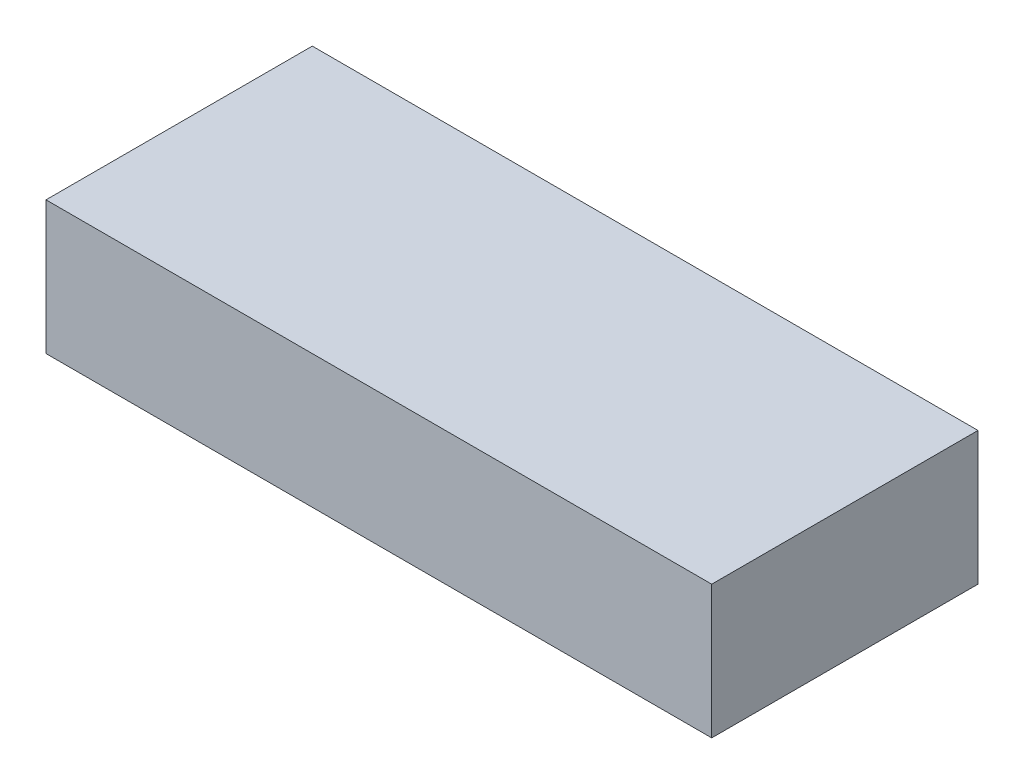
ISO-10303-21;
HEADER;
FILE_DESCRIPTION(('STEP AP214'),'2;1');
FILE_NAME('part.step','',(''),(''),'','','');
FILE_SCHEMA(('AUTOMOTIVE_DESIGN { 1 0 10303 214 1 1 1 1 }'));
ENDSEC;
DATA;
#1=APPLICATION_CONTEXT('core data for automotive mechanical design processes');
#2=APPLICATION_PROTOCOL_DEFINITION('international standard','automotive_design',2000,#1);
#3=PRODUCT_CONTEXT('',#1,'mechanical');
#4=PRODUCT('Part','Part','',(#3));
#5=PRODUCT_RELATED_PRODUCT_CATEGORY('part','',(#4));
#6=PRODUCT_DEFINITION_FORMATION('','',#4);
#7=PRODUCT_DEFINITION_CONTEXT('part definition',#1,'design');
#8=PRODUCT_DEFINITION('design','',#6,#7);
#9=PRODUCT_DEFINITION_SHAPE('','',#8);
#10=(LENGTH_UNIT() NAMED_UNIT(*) SI_UNIT(.MILLI.,.METRE.));
#11=(NAMED_UNIT(*) PLANE_ANGLE_UNIT() SI_UNIT($,.RADIAN.));
#12=(NAMED_UNIT(*) SI_UNIT($,.STERADIAN.) SOLID_ANGLE_UNIT());
#13=UNCERTAINTY_MEASURE_WITH_UNIT(LENGTH_MEASURE(1.E-05),#10,'distance_accuracy_value','');
#14=(GEOMETRIC_REPRESENTATION_CONTEXT(3) GLOBAL_UNCERTAINTY_ASSIGNED_CONTEXT((#13)) GLOBAL_UNIT_ASSIGNED_CONTEXT((#10,
#11,#12)) REPRESENTATION_CONTEXT('',''));
#15=CARTESIAN_POINT('',(0.,0.,0.));
#16=DIRECTION('',(0.,0.,1.));
#17=DIRECTION('',(1.,0.,0.));
#18=AXIS2_PLACEMENT_3D('',#15,#16,#17);
#19=CARTESIAN_POINT('',(500.,200.,-200.));
#20=DIRECTION('',(-1.,0.,0.));
#21=DIRECTION('',(0.,0.,-1.));
#22=AXIS2_PLACEMENT_3D('',#19,#20,#21);
#23=PLANE('',#22);
#24=DIRECTION('',(0.,0.,1.));
#25=VECTOR('',#24,1.);
#26=CARTESIAN_POINT('',(500.,0.,-200.));
#27=LINE('',#26,#25);
#28=CARTESIAN_POINT('',(500.,0.,-200.));
#29=VERTEX_POINT('',#28);
#30=CARTESIAN_POINT('',(500.,0.,200.));
#31=VERTEX_POINT('',#30);
#32=EDGE_CURVE('E116',#29,#31,#27,.T.);
#33=ORIENTED_EDGE('',*,*,#32,.F.);
#34=DIRECTION('',(0.,-1.,0.));
#35=VECTOR('',#34,1.);
#36=CARTESIAN_POINT('',(500.,200.,-200.));
#37=LINE('',#36,#35);
#38=CARTESIAN_POINT('',(500.,200.,-200.));
#39=VERTEX_POINT('',#38);
#40=EDGE_CURVE('E115',#39,#29,#37,.T.);
#41=ORIENTED_EDGE('',*,*,#40,.F.);
#42=DIRECTION('',(0.,0.,1.));
#43=VECTOR('',#42,1.);
#44=CARTESIAN_POINT('',(500.,200.,-200.));
#45=LINE('',#44,#43);
#46=CARTESIAN_POINT('',(500.,200.,200.));
#47=VERTEX_POINT('',#46);
#48=EDGE_CURVE('E108',#39,#47,#45,.T.);
#49=ORIENTED_EDGE('',*,*,#48,.T.);
#50=DIRECTION('',(0.,-1.,0.));
#51=VECTOR('',#50,1.);
#52=CARTESIAN_POINT('',(500.,200.,200.));
#53=LINE('',#52,#51);
#54=EDGE_CURVE('E11',#47,#31,#53,.T.);
#55=ORIENTED_EDGE('',*,*,#54,.T.);
#56=EDGE_LOOP('',(#33,#41,#49,#55));
#57=FACE_BOUND('',#56,.T.);
#58=ADVANCED_FACE('F47',(#57),#23,.F.);
#59=CARTESIAN_POINT('',(-500.,200.,200.));
#60=DIRECTION('',(0.,0.,-1.));
#61=DIRECTION('',(1.,0.,0.));
#62=AXIS2_PLACEMENT_3D('',#59,#60,#61);
#63=PLANE('',#62);
#64=DIRECTION('',(-1.,0.,0.));
#65=VECTOR('',#64,1.);
#66=CARTESIAN_POINT('',(-500.,0.,200.));
#67=LINE('',#66,#65);
#68=CARTESIAN_POINT('',(-500.,0.,200.));
#69=VERTEX_POINT('',#68);
#70=EDGE_CURVE('E119',#31,#69,#67,.T.);
#71=ORIENTED_EDGE('',*,*,#70,.F.);
#72=ORIENTED_EDGE('',*,*,#54,.F.);
#73=DIRECTION('',(-1.,0.,0.));
#74=VECTOR('',#73,1.);
#75=CARTESIAN_POINT('',(-500.,200.,200.));
#76=LINE('',#75,#74);
#77=CARTESIAN_POINT('',(-500.,200.,200.));
#78=VERTEX_POINT('',#77);
#79=EDGE_CURVE('E89',#47,#78,#76,.T.);
#80=ORIENTED_EDGE('',*,*,#79,.T.);
#81=DIRECTION('',(0.,-1.,0.));
#82=VECTOR('',#81,1.);
#83=CARTESIAN_POINT('',(-500.,200.,200.));
#84=LINE('',#83,#82);
#85=EDGE_CURVE('E56',#78,#69,#84,.T.);
#86=ORIENTED_EDGE('',*,*,#85,.T.);
#87=EDGE_LOOP('',(#71,#72,#80,#86));
#88=FACE_BOUND('',#87,.T.);
#89=ADVANCED_FACE('F105',(#88),#63,.F.);
#90=CARTESIAN_POINT('',(-500.,200.,-200.));
#91=DIRECTION('',(1.,0.,0.));
#92=DIRECTION('',(0.,0.,1.));
#93=AXIS2_PLACEMENT_3D('',#90,#91,#92);
#94=PLANE('',#93);
#95=DIRECTION('',(0.,0.,-1.));
#96=VECTOR('',#95,1.);
#97=CARTESIAN_POINT('',(-500.,0.,-200.));
#98=LINE('',#97,#96);
#99=CARTESIAN_POINT('',(-500.,0.,-200.));
#100=VERTEX_POINT('',#99);
#101=EDGE_CURVE('E100',#69,#100,#98,.T.);
#102=ORIENTED_EDGE('',*,*,#101,.F.);
#103=ORIENTED_EDGE('',*,*,#85,.F.);
#104=DIRECTION('',(0.,0.,-1.));
#105=VECTOR('',#104,1.);
#106=CARTESIAN_POINT('',(-500.,200.,-200.));
#107=LINE('',#106,#105);
#108=CARTESIAN_POINT('',(-500.,200.,-200.));
#109=VERTEX_POINT('',#108);
#110=EDGE_CURVE('E92',#78,#109,#107,.T.);
#111=ORIENTED_EDGE('',*,*,#110,.T.);
#112=DIRECTION('',(0.,-1.,0.));
#113=VECTOR('',#112,1.);
#114=CARTESIAN_POINT('',(-500.,200.,-200.));
#115=LINE('',#114,#113);
#116=EDGE_CURVE('E104',#109,#100,#115,.T.);
#117=ORIENTED_EDGE('',*,*,#116,.T.);
#118=EDGE_LOOP('',(#102,#103,#111,#117));
#119=FACE_BOUND('',#118,.T.);
#120=ADVANCED_FACE('F99',(#119),#94,.F.);
#121=CARTESIAN_POINT('',(-500.,200.,-200.));
#122=DIRECTION('',(0.,0.,1.));
#123=DIRECTION('',(-1.,0.,0.));
#124=AXIS2_PLACEMENT_3D('',#121,#122,#123);
#125=PLANE('',#124);
#126=DIRECTION('',(1.,0.,0.));
#127=VECTOR('',#126,1.);
#128=CARTESIAN_POINT('',(-500.,0.,-200.));
#129=LINE('',#128,#127);
#130=EDGE_CURVE('E78',#100,#29,#129,.T.);
#131=ORIENTED_EDGE('',*,*,#130,.F.);
#132=ORIENTED_EDGE('',*,*,#116,.F.);
#133=DIRECTION('',(1.,0.,0.));
#134=VECTOR('',#133,1.);
#135=CARTESIAN_POINT('',(-500.,200.,-200.));
#136=LINE('',#135,#134);
#137=EDGE_CURVE('E64',#109,#39,#136,.T.);
#138=ORIENTED_EDGE('',*,*,#137,.T.);
#139=ORIENTED_EDGE('',*,*,#40,.T.);
#140=EDGE_LOOP('',(#131,#132,#138,#139));
#141=FACE_BOUND('',#140,.T.);
#142=ADVANCED_FACE('F133',(#141),#125,.F.);
#143=CARTESIAN_POINT('',(0.,200.,0.));
#144=DIRECTION('',(0.,-1.,0.));
#145=DIRECTION('',(0.,0.,1.));
#146=AXIS2_PLACEMENT_3D('',#143,#144,#145);
#147=PLANE('',#146);
#148=ORIENTED_EDGE('',*,*,#48,.F.);
#149=ORIENTED_EDGE('',*,*,#137,.F.);
#150=ORIENTED_EDGE('',*,*,#110,.F.);
#151=ORIENTED_EDGE('',*,*,#79,.F.);
#152=EDGE_LOOP('',(#148,#149,#150,#151));
#153=FACE_BOUND('',#152,.T.);
#154=ADVANCED_FACE('F94',(#153),#147,.F.);
#155=CARTESIAN_POINT('',(0.,0.,0.));
#156=DIRECTION('',(0.,-1.,0.));
#157=DIRECTION('',(0.,0.,1.));
#158=AXIS2_PLACEMENT_3D('',#155,#156,#157);
#159=PLANE('',#158);
#160=ORIENTED_EDGE('',*,*,#32,.T.);
#161=ORIENTED_EDGE('',*,*,#70,.T.);
#162=ORIENTED_EDGE('',*,*,#101,.T.);
#163=ORIENTED_EDGE('',*,*,#130,.T.);
#164=EDGE_LOOP('',(#160,#161,#162,#163));
#165=FACE_BOUND('',#164,.T.);
#166=ADVANCED_FACE('F129',(#165),#159,.T.);
#167=CLOSED_SHELL('',(#58,#89,#120,#142,#154,#166));
#168=MANIFOLD_SOLID_BREP('B2',#167);
#169=ADVANCED_BREP_SHAPE_REPRESENTATION('',(#18,#168),#14);
#170=SHAPE_DEFINITION_REPRESENTATION(#9,#169);
ENDSEC;
END-ISO-10303-21;
